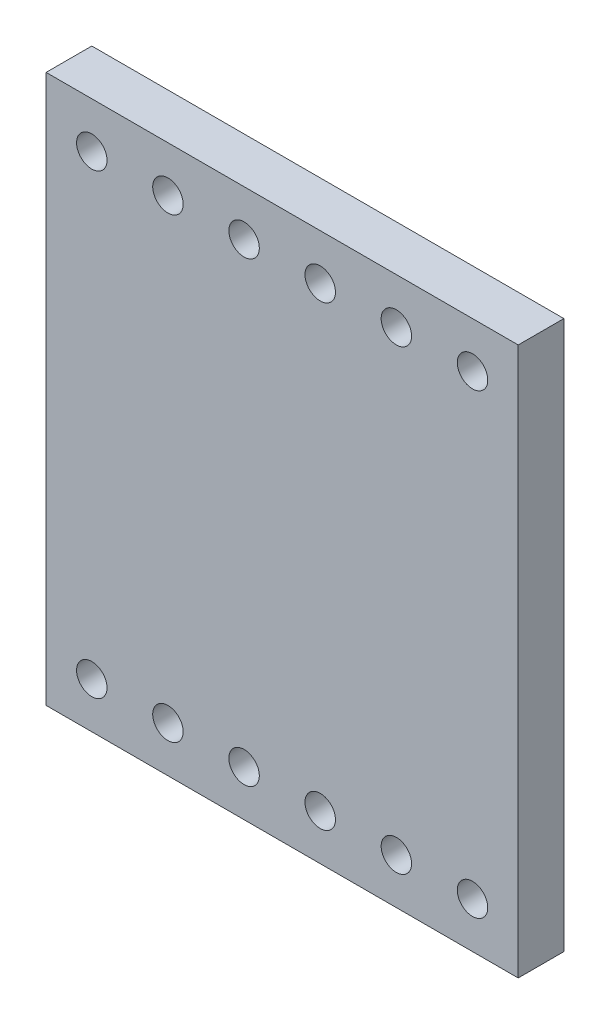
ISO-10303-21;
HEADER;
FILE_DESCRIPTION(('STEP AP214'),'2;1');
FILE_NAME('part.step','',(''),(''),'','','');
FILE_SCHEMA(('AUTOMOTIVE_DESIGN { 1 0 10303 214 1 1 1 1 }'));
ENDSEC;
DATA;
#1=APPLICATION_CONTEXT('core data for automotive mechanical design processes');
#2=APPLICATION_PROTOCOL_DEFINITION('international standard','automotive_design',2000,#1);
#3=PRODUCT_CONTEXT('',#1,'mechanical');
#4=PRODUCT('Part','Part','',(#3));
#5=PRODUCT_RELATED_PRODUCT_CATEGORY('part','',(#4));
#6=PRODUCT_DEFINITION_FORMATION('','',#4);
#7=PRODUCT_DEFINITION_CONTEXT('part definition',#1,'design');
#8=PRODUCT_DEFINITION('design','',#6,#7);
#9=PRODUCT_DEFINITION_SHAPE('','',#8);
#10=(LENGTH_UNIT() NAMED_UNIT(*) SI_UNIT(.MILLI.,.METRE.));
#11=(NAMED_UNIT(*) PLANE_ANGLE_UNIT() SI_UNIT($,.RADIAN.));
#12=(NAMED_UNIT(*) SI_UNIT($,.STERADIAN.) SOLID_ANGLE_UNIT());
#13=UNCERTAINTY_MEASURE_WITH_UNIT(LENGTH_MEASURE(1.E-05),#10,'distance_accuracy_value','');
#14=(GEOMETRIC_REPRESENTATION_CONTEXT(3) GLOBAL_UNCERTAINTY_ASSIGNED_CONTEXT((#13)) GLOBAL_UNIT_ASSIGNED_CONTEXT((#10,
#11,#12)) REPRESENTATION_CONTEXT('',''));
#15=CARTESIAN_POINT('',(0.,0.,0.));
#16=DIRECTION('',(0.,0.,1.));
#17=DIRECTION('',(1.,0.,0.));
#18=AXIS2_PLACEMENT_3D('',#15,#16,#17);
#19=CARTESIAN_POINT('',(7.75,9.,0.75));
#20=DIRECTION('',(0.,-1.,0.));
#21=DIRECTION('',(0.,0.,-1.));
#22=AXIS2_PLACEMENT_3D('',#19,#20,#21);
#23=PLANE('',#22);
#24=DIRECTION('',(-1.,0.,0.));
#25=VECTOR('',#24,1.);
#26=CARTESIAN_POINT('',(7.75,9.,-0.75));
#27=LINE('',#26,#25);
#28=CARTESIAN_POINT('',(7.75,9.,-0.75));
#29=VERTEX_POINT('',#28);
#30=CARTESIAN_POINT('',(-7.75,9.,-0.75));
#31=VERTEX_POINT('',#30);
#32=EDGE_CURVE('E113',#29,#31,#27,.T.);
#33=ORIENTED_EDGE('',*,*,#32,.T.);
#34=DIRECTION('',(0.,0.,-1.));
#35=VECTOR('',#34,1.);
#36=CARTESIAN_POINT('',(-7.75,9.,0.75));
#37=LINE('',#36,#35);
#38=CARTESIAN_POINT('',(-7.75,9.,0.75));
#39=VERTEX_POINT('',#38);
#40=EDGE_CURVE('E11',#39,#31,#37,.T.);
#41=ORIENTED_EDGE('',*,*,#40,.F.);
#42=DIRECTION('',(-1.,0.,0.));
#43=VECTOR('',#42,1.);
#44=CARTESIAN_POINT('',(7.75,9.,0.75));
#45=LINE('',#44,#43);
#46=CARTESIAN_POINT('',(7.75,9.,0.75));
#47=VERTEX_POINT('',#46);
#48=EDGE_CURVE('E97',#47,#39,#45,.T.);
#49=ORIENTED_EDGE('',*,*,#48,.F.);
#50=DIRECTION('',(0.,0.,-1.));
#51=VECTOR('',#50,1.);
#52=CARTESIAN_POINT('',(7.75,9.,0.75));
#53=LINE('',#52,#51);
#54=EDGE_CURVE('E109',#47,#29,#53,.T.);
#55=ORIENTED_EDGE('',*,*,#54,.T.);
#56=EDGE_LOOP('',(#33,#41,#49,#55));
#57=FACE_BOUND('',#56,.T.);
#58=ADVANCED_FACE('F45',(#57),#23,.F.);
#59=CARTESIAN_POINT('',(-7.75,-9.,0.75));
#60=DIRECTION('',(1.,0.,0.));
#61=DIRECTION('',(0.,0.,-1.));
#62=AXIS2_PLACEMENT_3D('',#59,#60,#61);
#63=PLANE('',#62);
#64=DIRECTION('',(0.,-1.,0.));
#65=VECTOR('',#64,1.);
#66=CARTESIAN_POINT('',(-7.75,-9.,-0.75));
#67=LINE('',#66,#65);
#68=CARTESIAN_POINT('',(-7.75,-9.,-0.75));
#69=VERTEX_POINT('',#68);
#70=EDGE_CURVE('E102',#31,#69,#67,.T.);
#71=ORIENTED_EDGE('',*,*,#70,.T.);
#72=DIRECTION('',(0.,0.,-1.));
#73=VECTOR('',#72,1.);
#74=CARTESIAN_POINT('',(-7.75,-9.,0.75));
#75=LINE('',#74,#73);
#76=CARTESIAN_POINT('',(-7.75,-9.,0.75));
#77=VERTEX_POINT('',#76);
#78=EDGE_CURVE('E54',#77,#69,#75,.T.);
#79=ORIENTED_EDGE('',*,*,#78,.F.);
#80=DIRECTION('',(0.,-1.,0.));
#81=VECTOR('',#80,1.);
#82=CARTESIAN_POINT('',(-7.75,-9.,0.75));
#83=LINE('',#82,#81);
#84=EDGE_CURVE('E92',#39,#77,#83,.T.);
#85=ORIENTED_EDGE('',*,*,#84,.F.);
#86=ORIENTED_EDGE('',*,*,#40,.T.);
#87=EDGE_LOOP('',(#71,#79,#85,#86));
#88=FACE_BOUND('',#87,.T.);
#89=ADVANCED_FACE('F101',(#88),#63,.F.);
#90=CARTESIAN_POINT('',(7.75,-9.,0.75));
#91=DIRECTION('',(0.,1.,0.));
#92=DIRECTION('',(0.,0.,1.));
#93=AXIS2_PLACEMENT_3D('',#90,#91,#92);
#94=PLANE('',#93);
#95=DIRECTION('',(1.,0.,0.));
#96=VECTOR('',#95,1.);
#97=CARTESIAN_POINT('',(7.75,-9.,-0.75));
#98=LINE('',#97,#96);
#99=CARTESIAN_POINT('',(7.75,-9.,-0.75));
#100=VERTEX_POINT('',#99);
#101=EDGE_CURVE('E79',#69,#100,#98,.T.);
#102=ORIENTED_EDGE('',*,*,#101,.T.);
#103=DIRECTION('',(0.,0.,-1.));
#104=VECTOR('',#103,1.);
#105=CARTESIAN_POINT('',(7.75,-9.,0.75));
#106=LINE('',#105,#104);
#107=CARTESIAN_POINT('',(7.75,-9.,0.75));
#108=VERTEX_POINT('',#107);
#109=EDGE_CURVE('E104',#108,#100,#106,.T.);
#110=ORIENTED_EDGE('',*,*,#109,.F.);
#111=DIRECTION('',(1.,0.,0.));
#112=VECTOR('',#111,1.);
#113=CARTESIAN_POINT('',(7.75,-9.,0.75));
#114=LINE('',#113,#112);
#115=EDGE_CURVE('E95',#77,#108,#114,.T.);
#116=ORIENTED_EDGE('',*,*,#115,.F.);
#117=ORIENTED_EDGE('',*,*,#78,.T.);
#118=EDGE_LOOP('',(#102,#110,#116,#117));
#119=FACE_BOUND('',#118,.T.);
#120=ADVANCED_FACE('F105',(#119),#94,.F.);
#121=CARTESIAN_POINT('',(7.75,-9.,0.75));
#122=DIRECTION('',(-1.,0.,0.));
#123=DIRECTION('',(0.,0.,1.));
#124=AXIS2_PLACEMENT_3D('',#121,#122,#123);
#125=PLANE('',#124);
#126=DIRECTION('',(0.,1.,0.));
#127=VECTOR('',#126,1.);
#128=CARTESIAN_POINT('',(7.75,-9.,-0.75));
#129=LINE('',#128,#127);
#130=EDGE_CURVE('E85',#100,#29,#129,.T.);
#131=ORIENTED_EDGE('',*,*,#130,.T.);
#132=ORIENTED_EDGE('',*,*,#54,.F.);
#133=DIRECTION('',(0.,1.,0.));
#134=VECTOR('',#133,1.);
#135=CARTESIAN_POINT('',(7.75,-9.,0.75));
#136=LINE('',#135,#134);
#137=EDGE_CURVE('E62',#108,#47,#136,.T.);
#138=ORIENTED_EDGE('',*,*,#137,.F.);
#139=ORIENTED_EDGE('',*,*,#109,.T.);
#140=EDGE_LOOP('',(#131,#132,#138,#139));
#141=FACE_BOUND('',#140,.T.);
#142=ADVANCED_FACE('F127',(#141),#125,.F.);
#143=CARTESIAN_POINT('',(0.,0.,0.75));
#144=DIRECTION('',(0.,0.,-1.));
#145=DIRECTION('',(-1.,0.,0.));
#146=AXIS2_PLACEMENT_3D('',#143,#144,#145);
#147=PLANE('',#146);
#148=CARTESIAN_POINT('',(-6.25,7.5,0.75));
#149=DIRECTION('',(0.,0.,-1.));
#150=DIRECTION('',(1.,0.,0.));
#151=AXIS2_PLACEMENT_3D('',#148,#149,#150);
#152=CIRCLE('',#151,0.500000000000002);
#153=CARTESIAN_POINT('',(-5.75,7.5,0.75));
#154=VERTEX_POINT('',#153);
#155=EDGE_CURVE('E222',#154,#154,#152,.T.);
#156=ORIENTED_EDGE('',*,*,#155,.T.);
#157=EDGE_LOOP('',(#156));
#158=FACE_BOUND('',#157,.T.);
#159=CARTESIAN_POINT('',(-3.75,7.5,0.75));
#160=DIRECTION('',(0.,0.,-1.));
#161=DIRECTION('',(1.,0.,0.));
#162=AXIS2_PLACEMENT_3D('',#159,#160,#161);
#163=CIRCLE('',#162,0.500000000000002);
#164=CARTESIAN_POINT('',(-3.25,7.5,0.75));
#165=VERTEX_POINT('',#164);
#166=EDGE_CURVE('E214',#165,#165,#163,.T.);
#167=ORIENTED_EDGE('',*,*,#166,.T.);
#168=EDGE_LOOP('',(#167));
#169=FACE_BOUND('',#168,.T.);
#170=CARTESIAN_POINT('',(-1.25,7.5,0.75));
#171=DIRECTION('',(0.,0.,-1.));
#172=DIRECTION('',(1.,0.,0.));
#173=AXIS2_PLACEMENT_3D('',#170,#171,#172);
#174=CIRCLE('',#173,0.500000000000002);
#175=CARTESIAN_POINT('',(-0.749999999999999,7.5,0.75));
#176=VERTEX_POINT('',#175);
#177=EDGE_CURVE('E206',#176,#176,#174,.T.);
#178=ORIENTED_EDGE('',*,*,#177,.T.);
#179=EDGE_LOOP('',(#178));
#180=FACE_BOUND('',#179,.T.);
#181=CARTESIAN_POINT('',(1.25,7.5,0.75));
#182=DIRECTION('',(0.,0.,-1.));
#183=DIRECTION('',(1.,0.,0.));
#184=AXIS2_PLACEMENT_3D('',#181,#182,#183);
#185=CIRCLE('',#184,0.500000000000002);
#186=CARTESIAN_POINT('',(1.75,7.5,0.75));
#187=VERTEX_POINT('',#186);
#188=EDGE_CURVE('E198',#187,#187,#185,.T.);
#189=ORIENTED_EDGE('',*,*,#188,.T.);
#190=EDGE_LOOP('',(#189));
#191=FACE_BOUND('',#190,.T.);
#192=CARTESIAN_POINT('',(3.75,7.5,0.75));
#193=DIRECTION('',(0.,0.,-1.));
#194=DIRECTION('',(1.,0.,0.));
#195=AXIS2_PLACEMENT_3D('',#192,#193,#194);
#196=CIRCLE('',#195,0.500000000000002);
#197=CARTESIAN_POINT('',(4.25,7.5,0.75));
#198=VERTEX_POINT('',#197);
#199=EDGE_CURVE('E190',#198,#198,#196,.T.);
#200=ORIENTED_EDGE('',*,*,#199,.T.);
#201=EDGE_LOOP('',(#200));
#202=FACE_BOUND('',#201,.T.);
#203=CARTESIAN_POINT('',(6.25,7.5,0.75));
#204=DIRECTION('',(0.,0.,-1.));
#205=DIRECTION('',(1.,0.,0.));
#206=AXIS2_PLACEMENT_3D('',#203,#204,#205);
#207=CIRCLE('',#206,0.500000000000002);
#208=CARTESIAN_POINT('',(6.75,7.5,0.75));
#209=VERTEX_POINT('',#208);
#210=EDGE_CURVE('E182',#209,#209,#207,.T.);
#211=ORIENTED_EDGE('',*,*,#210,.T.);
#212=EDGE_LOOP('',(#211));
#213=FACE_BOUND('',#212,.T.);
#214=CARTESIAN_POINT('',(-6.25,-7.5,0.75));
#215=DIRECTION('',(0.,0.,1.));
#216=DIRECTION('',(1.,0.,0.));
#217=AXIS2_PLACEMENT_3D('',#214,#215,#216);
#218=CIRCLE('',#217,0.500000000000002);
#219=CARTESIAN_POINT('',(-5.75,-7.5,0.75));
#220=VERTEX_POINT('',#219);
#221=EDGE_CURVE('E175',#220,#220,#218,.T.);
#222=ORIENTED_EDGE('',*,*,#221,.F.);
#223=EDGE_LOOP('',(#222));
#224=FACE_BOUND('',#223,.T.);
#225=CARTESIAN_POINT('',(-3.75,-7.5,0.75));
#226=DIRECTION('',(0.,0.,1.));
#227=DIRECTION('',(1.,0.,0.));
#228=AXIS2_PLACEMENT_3D('',#225,#226,#227);
#229=CIRCLE('',#228,0.500000000000002);
#230=CARTESIAN_POINT('',(-3.25,-7.5,0.75));
#231=VERTEX_POINT('',#230);
#232=EDGE_CURVE('E171',#231,#231,#229,.T.);
#233=ORIENTED_EDGE('',*,*,#232,.F.);
#234=EDGE_LOOP('',(#233));
#235=FACE_BOUND('',#234,.T.);
#236=CARTESIAN_POINT('',(-1.25,-7.5,0.75));
#237=DIRECTION('',(0.,0.,1.));
#238=DIRECTION('',(1.,0.,0.));
#239=AXIS2_PLACEMENT_3D('',#236,#237,#238);
#240=CIRCLE('',#239,0.500000000000002);
#241=CARTESIAN_POINT('',(-0.749999999999999,-7.5,0.75));
#242=VERTEX_POINT('',#241);
#243=EDGE_CURVE('E163',#242,#242,#240,.T.);
#244=ORIENTED_EDGE('',*,*,#243,.F.);
#245=EDGE_LOOP('',(#244));
#246=FACE_BOUND('',#245,.T.);
#247=CARTESIAN_POINT('',(1.25,-7.5,0.75));
#248=DIRECTION('',(0.,0.,1.));
#249=DIRECTION('',(1.,0.,0.));
#250=AXIS2_PLACEMENT_3D('',#247,#248,#249);
#251=CIRCLE('',#250,0.500000000000002);
#252=CARTESIAN_POINT('',(1.75,-7.5,0.75));
#253=VERTEX_POINT('',#252);
#254=EDGE_CURVE('E155',#253,#253,#251,.T.);
#255=ORIENTED_EDGE('',*,*,#254,.F.);
#256=EDGE_LOOP('',(#255));
#257=FACE_BOUND('',#256,.T.);
#258=CARTESIAN_POINT('',(3.75,-7.5,0.75));
#259=DIRECTION('',(0.,0.,1.));
#260=DIRECTION('',(1.,0.,0.));
#261=AXIS2_PLACEMENT_3D('',#258,#259,#260);
#262=CIRCLE('',#261,0.500000000000002);
#263=CARTESIAN_POINT('',(4.25,-7.5,0.75));
#264=VERTEX_POINT('',#263);
#265=EDGE_CURVE('E147',#264,#264,#262,.T.);
#266=ORIENTED_EDGE('',*,*,#265,.F.);
#267=EDGE_LOOP('',(#266));
#268=FACE_BOUND('',#267,.T.);
#269=CARTESIAN_POINT('',(6.25,-7.5,0.75));
#270=DIRECTION('',(0.,0.,1.));
#271=DIRECTION('',(1.,0.,0.));
#272=AXIS2_PLACEMENT_3D('',#269,#270,#271);
#273=CIRCLE('',#272,0.500000000000002);
#274=CARTESIAN_POINT('',(6.75,-7.5,0.75));
#275=VERTEX_POINT('',#274);
#276=EDGE_CURVE('E138',#275,#275,#273,.T.);
#277=ORIENTED_EDGE('',*,*,#276,.F.);
#278=EDGE_LOOP('',(#277));
#279=FACE_BOUND('',#278,.T.);
#280=ORIENTED_EDGE('',*,*,#48,.T.);
#281=ORIENTED_EDGE('',*,*,#84,.T.);
#282=ORIENTED_EDGE('',*,*,#115,.T.);
#283=ORIENTED_EDGE('',*,*,#137,.T.);
#284=EDGE_LOOP('',(#280,#281,#282,#283));
#285=FACE_BOUND('',#284,.T.);
#286=ADVANCED_FACE('F93',(#158,#169,#180,#191,#202,#213,#224,#235,#246,#257,#268,#279,#285),
#147,.F.);
#287=CARTESIAN_POINT('',(0.,0.,-0.75));
#288=DIRECTION('',(0.,0.,-1.));
#289=DIRECTION('',(-1.,0.,0.));
#290=AXIS2_PLACEMENT_3D('',#287,#288,#289);
#291=PLANE('',#290);
#292=CARTESIAN_POINT('',(-6.25,7.5,-0.75));
#293=DIRECTION('',(0.,0.,-1.));
#294=DIRECTION('',(1.,0.,0.));
#295=AXIS2_PLACEMENT_3D('',#292,#293,#294);
#296=CIRCLE('',#295,0.500000000000002);
#297=CARTESIAN_POINT('',(-5.75,7.5,-0.75));
#298=VERTEX_POINT('',#297);
#299=EDGE_CURVE('E139',#298,#298,#296,.T.);
#300=ORIENTED_EDGE('',*,*,#299,.F.);
#301=EDGE_LOOP('',(#300));
#302=FACE_BOUND('',#301,.T.);
#303=CARTESIAN_POINT('',(-3.75,7.5,-0.75));
#304=DIRECTION('',(0.,0.,-1.));
#305=DIRECTION('',(1.,0.,0.));
#306=AXIS2_PLACEMENT_3D('',#303,#304,#305);
#307=CIRCLE('',#306,0.500000000000002);
#308=CARTESIAN_POINT('',(-3.25,7.5,-0.75));
#309=VERTEX_POINT('',#308);
#310=EDGE_CURVE('E218',#309,#309,#307,.T.);
#311=ORIENTED_EDGE('',*,*,#310,.F.);
#312=EDGE_LOOP('',(#311));
#313=FACE_BOUND('',#312,.T.);
#314=CARTESIAN_POINT('',(-1.25,7.5,-0.75));
#315=DIRECTION('',(0.,0.,-1.));
#316=DIRECTION('',(1.,0.,0.));
#317=AXIS2_PLACEMENT_3D('',#314,#315,#316);
#318=CIRCLE('',#317,0.500000000000002);
#319=CARTESIAN_POINT('',(-0.749999999999999,7.5,-0.75));
#320=VERTEX_POINT('',#319);
#321=EDGE_CURVE('E210',#320,#320,#318,.T.);
#322=ORIENTED_EDGE('',*,*,#321,.F.);
#323=EDGE_LOOP('',(#322));
#324=FACE_BOUND('',#323,.T.);
#325=CARTESIAN_POINT('',(1.25,7.5,-0.75));
#326=DIRECTION('',(0.,0.,-1.));
#327=DIRECTION('',(1.,0.,0.));
#328=AXIS2_PLACEMENT_3D('',#325,#326,#327);
#329=CIRCLE('',#328,0.500000000000002);
#330=CARTESIAN_POINT('',(1.75,7.5,-0.75));
#331=VERTEX_POINT('',#330);
#332=EDGE_CURVE('E202',#331,#331,#329,.T.);
#333=ORIENTED_EDGE('',*,*,#332,.F.);
#334=EDGE_LOOP('',(#333));
#335=FACE_BOUND('',#334,.T.);
#336=CARTESIAN_POINT('',(3.75,7.5,-0.75));
#337=DIRECTION('',(0.,0.,-1.));
#338=DIRECTION('',(1.,0.,0.));
#339=AXIS2_PLACEMENT_3D('',#336,#337,#338);
#340=CIRCLE('',#339,0.500000000000002);
#341=CARTESIAN_POINT('',(4.25,7.5,-0.75));
#342=VERTEX_POINT('',#341);
#343=EDGE_CURVE('E194',#342,#342,#340,.T.);
#344=ORIENTED_EDGE('',*,*,#343,.F.);
#345=EDGE_LOOP('',(#344));
#346=FACE_BOUND('',#345,.T.);
#347=CARTESIAN_POINT('',(6.25,7.5,-0.75));
#348=DIRECTION('',(0.,0.,-1.));
#349=DIRECTION('',(1.,0.,0.));
#350=AXIS2_PLACEMENT_3D('',#347,#348,#349);
#351=CIRCLE('',#350,0.500000000000002);
#352=CARTESIAN_POINT('',(6.75,7.5,-0.75));
#353=VERTEX_POINT('',#352);
#354=EDGE_CURVE('E186',#353,#353,#351,.T.);
#355=ORIENTED_EDGE('',*,*,#354,.F.);
#356=EDGE_LOOP('',(#355));
#357=FACE_BOUND('',#356,.T.);
#358=CARTESIAN_POINT('',(-6.25,-7.5,-0.75));
#359=DIRECTION('',(0.,0.,1.));
#360=DIRECTION('',(1.,0.,0.));
#361=AXIS2_PLACEMENT_3D('',#358,#359,#360);
#362=CIRCLE('',#361,0.500000000000002);
#363=CARTESIAN_POINT('',(-5.75,-7.5,-0.75));
#364=VERTEX_POINT('',#363);
#365=EDGE_CURVE('E117',#364,#364,#362,.T.);
#366=ORIENTED_EDGE('',*,*,#365,.T.);
#367=EDGE_LOOP('',(#366));
#368=FACE_BOUND('',#367,.T.);
#369=CARTESIAN_POINT('',(-3.75,-7.5,-0.75));
#370=DIRECTION('',(0.,0.,1.));
#371=DIRECTION('',(1.,0.,0.));
#372=AXIS2_PLACEMENT_3D('',#369,#370,#371);
#373=CIRCLE('',#372,0.500000000000002);
#374=CARTESIAN_POINT('',(-3.25,-7.5,-0.75));
#375=VERTEX_POINT('',#374);
#376=EDGE_CURVE('E167',#375,#375,#373,.T.);
#377=ORIENTED_EDGE('',*,*,#376,.T.);
#378=EDGE_LOOP('',(#377));
#379=FACE_BOUND('',#378,.T.);
#380=CARTESIAN_POINT('',(-1.25,-7.5,-0.75));
#381=DIRECTION('',(0.,0.,1.));
#382=DIRECTION('',(1.,0.,0.));
#383=AXIS2_PLACEMENT_3D('',#380,#381,#382);
#384=CIRCLE('',#383,0.500000000000002);
#385=CARTESIAN_POINT('',(-0.749999999999999,-7.5,-0.75));
#386=VERTEX_POINT('',#385);
#387=EDGE_CURVE('E159',#386,#386,#384,.T.);
#388=ORIENTED_EDGE('',*,*,#387,.T.);
#389=EDGE_LOOP('',(#388));
#390=FACE_BOUND('',#389,.T.);
#391=CARTESIAN_POINT('',(1.25,-7.5,-0.75));
#392=DIRECTION('',(0.,0.,1.));
#393=DIRECTION('',(1.,0.,0.));
#394=AXIS2_PLACEMENT_3D('',#391,#392,#393);
#395=CIRCLE('',#394,0.500000000000002);
#396=CARTESIAN_POINT('',(1.75,-7.5,-0.75));
#397=VERTEX_POINT('',#396);
#398=EDGE_CURVE('E151',#397,#397,#395,.T.);
#399=ORIENTED_EDGE('',*,*,#398,.T.);
#400=EDGE_LOOP('',(#399));
#401=FACE_BOUND('',#400,.T.);
#402=CARTESIAN_POINT('',(3.75,-7.5,-0.75));
#403=DIRECTION('',(0.,0.,1.));
#404=DIRECTION('',(1.,0.,0.));
#405=AXIS2_PLACEMENT_3D('',#402,#403,#404);
#406=CIRCLE('',#405,0.500000000000002);
#407=CARTESIAN_POINT('',(4.25,-7.5,-0.75));
#408=VERTEX_POINT('',#407);
#409=EDGE_CURVE('E143',#408,#408,#406,.T.);
#410=ORIENTED_EDGE('',*,*,#409,.T.);
#411=EDGE_LOOP('',(#410));
#412=FACE_BOUND('',#411,.T.);
#413=CARTESIAN_POINT('',(6.25,-7.5,-0.75));
#414=DIRECTION('',(0.,0.,1.));
#415=DIRECTION('',(1.,0.,0.));
#416=AXIS2_PLACEMENT_3D('',#413,#414,#415);
#417=CIRCLE('',#416,0.500000000000002);
#418=CARTESIAN_POINT('',(6.75,-7.5,-0.75));
#419=VERTEX_POINT('',#418);
#420=EDGE_CURVE('E134',#419,#419,#417,.T.);
#421=ORIENTED_EDGE('',*,*,#420,.T.);
#422=EDGE_LOOP('',(#421));
#423=FACE_BOUND('',#422,.T.);
#424=ORIENTED_EDGE('',*,*,#32,.F.);
#425=ORIENTED_EDGE('',*,*,#130,.F.);
#426=ORIENTED_EDGE('',*,*,#101,.F.);
#427=ORIENTED_EDGE('',*,*,#70,.F.);
#428=EDGE_LOOP('',(#424,#425,#426,#427));
#429=FACE_BOUND('',#428,.T.);
#430=ADVANCED_FACE('F130',(#302,#313,#324,#335,#346,#357,#368,#379,#390,#401,#412,#423,#429),
#291,.T.);
#431=CARTESIAN_POINT('',(6.25,-7.5,-0.75));
#432=DIRECTION('',(0.,0.,1.));
#433=DIRECTION('',(1.,0.,0.));
#434=AXIS2_PLACEMENT_3D('',#431,#432,#433);
#435=CYLINDRICAL_SURFACE('',#434,0.500000000000002);
#436=ORIENTED_EDGE('',*,*,#420,.F.);
#437=EDGE_LOOP('',(#436));
#438=FACE_BOUND('',#437,.T.);
#439=ORIENTED_EDGE('',*,*,#276,.T.);
#440=EDGE_LOOP('',(#439));
#441=FACE_BOUND('',#440,.T.);
#442=ADVANCED_FACE('F235',(#438,#441),#435,.F.);
#443=CARTESIAN_POINT('',(3.75,-7.5,-0.75));
#444=DIRECTION('',(0.,0.,1.));
#445=DIRECTION('',(1.,0.,0.));
#446=AXIS2_PLACEMENT_3D('',#443,#444,#445);
#447=CYLINDRICAL_SURFACE('',#446,0.500000000000002);
#448=ORIENTED_EDGE('',*,*,#409,.F.);
#449=EDGE_LOOP('',(#448));
#450=FACE_BOUND('',#449,.T.);
#451=ORIENTED_EDGE('',*,*,#265,.T.);
#452=EDGE_LOOP('',(#451));
#453=FACE_BOUND('',#452,.T.);
#454=ADVANCED_FACE('F261',(#450,#453),#447,.F.);
#455=CARTESIAN_POINT('',(1.25,-7.5,-0.75));
#456=DIRECTION('',(0.,0.,1.));
#457=DIRECTION('',(1.,0.,0.));
#458=AXIS2_PLACEMENT_3D('',#455,#456,#457);
#459=CYLINDRICAL_SURFACE('',#458,0.500000000000002);
#460=ORIENTED_EDGE('',*,*,#398,.F.);
#461=EDGE_LOOP('',(#460));
#462=FACE_BOUND('',#461,.T.);
#463=ORIENTED_EDGE('',*,*,#254,.T.);
#464=EDGE_LOOP('',(#463));
#465=FACE_BOUND('',#464,.T.);
#466=ADVANCED_FACE('F302',(#462,#465),#459,.F.);
#467=CARTESIAN_POINT('',(-1.25,-7.5,-0.75));
#468=DIRECTION('',(0.,0.,1.));
#469=DIRECTION('',(1.,0.,0.));
#470=AXIS2_PLACEMENT_3D('',#467,#468,#469);
#471=CYLINDRICAL_SURFACE('',#470,0.500000000000002);
#472=ORIENTED_EDGE('',*,*,#387,.F.);
#473=EDGE_LOOP('',(#472));
#474=FACE_BOUND('',#473,.T.);
#475=ORIENTED_EDGE('',*,*,#243,.T.);
#476=EDGE_LOOP('',(#475));
#477=FACE_BOUND('',#476,.T.);
#478=ADVANCED_FACE('F311',(#474,#477),#471,.F.);
#479=CARTESIAN_POINT('',(-3.75,-7.5,-0.75));
#480=DIRECTION('',(0.,0.,1.));
#481=DIRECTION('',(1.,0.,0.));
#482=AXIS2_PLACEMENT_3D('',#479,#480,#481);
#483=CYLINDRICAL_SURFACE('',#482,0.500000000000002);
#484=ORIENTED_EDGE('',*,*,#376,.F.);
#485=EDGE_LOOP('',(#484));
#486=FACE_BOUND('',#485,.T.);
#487=ORIENTED_EDGE('',*,*,#232,.T.);
#488=EDGE_LOOP('',(#487));
#489=FACE_BOUND('',#488,.T.);
#490=ADVANCED_FACE('F320',(#486,#489),#483,.F.);
#491=CARTESIAN_POINT('',(-6.25,-7.5,-0.75));
#492=DIRECTION('',(0.,0.,1.));
#493=DIRECTION('',(1.,0.,0.));
#494=AXIS2_PLACEMENT_3D('',#491,#492,#493);
#495=CYLINDRICAL_SURFACE('',#494,0.500000000000002);
#496=ORIENTED_EDGE('',*,*,#365,.F.);
#497=EDGE_LOOP('',(#496));
#498=FACE_BOUND('',#497,.T.);
#499=ORIENTED_EDGE('',*,*,#221,.T.);
#500=EDGE_LOOP('',(#499));
#501=FACE_BOUND('',#500,.T.);
#502=ADVANCED_FACE('F328',(#498,#501),#495,.F.);
#503=CARTESIAN_POINT('',(6.25,7.5,-0.75));
#504=DIRECTION('',(0.,0.,1.));
#505=DIRECTION('',(1.,0.,0.));
#506=AXIS2_PLACEMENT_3D('',#503,#504,#505);
#507=CYLINDRICAL_SURFACE('',#506,0.500000000000002);
#508=ORIENTED_EDGE('',*,*,#354,.T.);
#509=EDGE_LOOP('',(#508));
#510=FACE_BOUND('',#509,.T.);
#511=ORIENTED_EDGE('',*,*,#210,.F.);
#512=EDGE_LOOP('',(#511));
#513=FACE_BOUND('',#512,.T.);
#514=ADVANCED_FACE('F336',(#510,#513),#507,.F.);
#515=CARTESIAN_POINT('',(3.75,7.5,-0.75));
#516=DIRECTION('',(0.,0.,1.));
#517=DIRECTION('',(1.,0.,0.));
#518=AXIS2_PLACEMENT_3D('',#515,#516,#517);
#519=CYLINDRICAL_SURFACE('',#518,0.500000000000002);
#520=ORIENTED_EDGE('',*,*,#343,.T.);
#521=EDGE_LOOP('',(#520));
#522=FACE_BOUND('',#521,.T.);
#523=ORIENTED_EDGE('',*,*,#199,.F.);
#524=EDGE_LOOP('',(#523));
#525=FACE_BOUND('',#524,.T.);
#526=ADVANCED_FACE('F349',(#522,#525),#519,.F.);
#527=CARTESIAN_POINT('',(1.25,7.5,-0.75));
#528=DIRECTION('',(0.,0.,1.));
#529=DIRECTION('',(1.,0.,0.));
#530=AXIS2_PLACEMENT_3D('',#527,#528,#529);
#531=CYLINDRICAL_SURFACE('',#530,0.500000000000002);
#532=ORIENTED_EDGE('',*,*,#332,.T.);
#533=EDGE_LOOP('',(#532));
#534=FACE_BOUND('',#533,.T.);
#535=ORIENTED_EDGE('',*,*,#188,.F.);
#536=EDGE_LOOP('',(#535));
#537=FACE_BOUND('',#536,.T.);
#538=ADVANCED_FACE('F359',(#534,#537),#531,.F.);
#539=CARTESIAN_POINT('',(-1.25,7.5,-0.75));
#540=DIRECTION('',(0.,0.,1.));
#541=DIRECTION('',(1.,0.,0.));
#542=AXIS2_PLACEMENT_3D('',#539,#540,#541);
#543=CYLINDRICAL_SURFACE('',#542,0.500000000000002);
#544=ORIENTED_EDGE('',*,*,#321,.T.);
#545=EDGE_LOOP('',(#544));
#546=FACE_BOUND('',#545,.T.);
#547=ORIENTED_EDGE('',*,*,#177,.F.);
#548=EDGE_LOOP('',(#547));
#549=FACE_BOUND('',#548,.T.);
#550=ADVANCED_FACE('F369',(#546,#549),#543,.F.);
#551=CARTESIAN_POINT('',(-3.75,7.5,-0.75));
#552=DIRECTION('',(0.,0.,1.));
#553=DIRECTION('',(1.,0.,0.));
#554=AXIS2_PLACEMENT_3D('',#551,#552,#553);
#555=CYLINDRICAL_SURFACE('',#554,0.500000000000002);
#556=ORIENTED_EDGE('',*,*,#310,.T.);
#557=EDGE_LOOP('',(#556));
#558=FACE_BOUND('',#557,.T.);
#559=ORIENTED_EDGE('',*,*,#166,.F.);
#560=EDGE_LOOP('',(#559));
#561=FACE_BOUND('',#560,.T.);
#562=ADVANCED_FACE('F379',(#558,#561),#555,.F.);
#563=CARTESIAN_POINT('',(-6.25,7.5,-0.75));
#564=DIRECTION('',(0.,0.,1.));
#565=DIRECTION('',(1.,0.,0.));
#566=AXIS2_PLACEMENT_3D('',#563,#564,#565);
#567=CYLINDRICAL_SURFACE('',#566,0.500000000000002);
#568=ORIENTED_EDGE('',*,*,#299,.T.);
#569=EDGE_LOOP('',(#568));
#570=FACE_BOUND('',#569,.T.);
#571=ORIENTED_EDGE('',*,*,#155,.F.);
#572=EDGE_LOOP('',(#571));
#573=FACE_BOUND('',#572,.T.);
#574=ADVANCED_FACE('F230',(#570,#573),#567,.F.);
#575=CLOSED_SHELL('',(#58,#89,#120,#142,#286,#430,#442,#454,#466,#478,#490,#502,#514,#526,#538,
#550,#562,#574));
#576=MANIFOLD_SOLID_BREP('B2',#575);
#577=ADVANCED_BREP_SHAPE_REPRESENTATION('',(#18,#576),#14);
#578=SHAPE_DEFINITION_REPRESENTATION(#9,#577);
ENDSEC;
END-ISO-10303-21;
